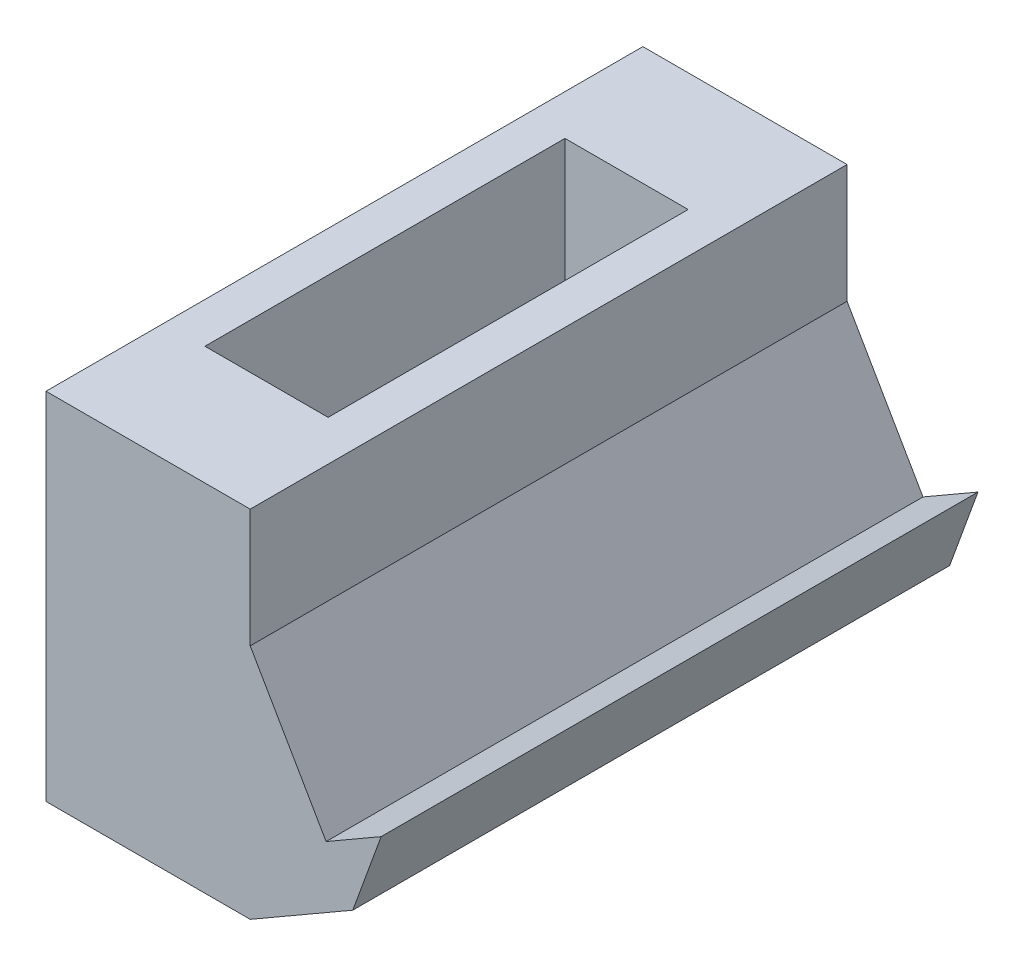
ISO-10303-21;
HEADER;
FILE_DESCRIPTION(('STEP AP214'),'2;1');
FILE_NAME('part.step','',(''),(''),'','','');
FILE_SCHEMA(('AUTOMOTIVE_DESIGN { 1 0 10303 214 1 1 1 1 }'));
ENDSEC;
DATA;
#1=APPLICATION_CONTEXT('core data for automotive mechanical design processes');
#2=APPLICATION_PROTOCOL_DEFINITION('international standard','automotive_design',2000,#1);
#3=PRODUCT_CONTEXT('',#1,'mechanical');
#4=PRODUCT('Part','Part','',(#3));
#5=PRODUCT_RELATED_PRODUCT_CATEGORY('part','',(#4));
#6=PRODUCT_DEFINITION_FORMATION('','',#4);
#7=PRODUCT_DEFINITION_CONTEXT('part definition',#1,'design');
#8=PRODUCT_DEFINITION('design','',#6,#7);
#9=PRODUCT_DEFINITION_SHAPE('','',#8);
#10=(LENGTH_UNIT() NAMED_UNIT(*) SI_UNIT(.MILLI.,.METRE.));
#11=(NAMED_UNIT(*) PLANE_ANGLE_UNIT() SI_UNIT($,.RADIAN.));
#12=(NAMED_UNIT(*) SI_UNIT($,.STERADIAN.) SOLID_ANGLE_UNIT());
#13=UNCERTAINTY_MEASURE_WITH_UNIT(LENGTH_MEASURE(1.E-05),#10,'distance_accuracy_value','');
#14=(GEOMETRIC_REPRESENTATION_CONTEXT(3) GLOBAL_UNCERTAINTY_ASSIGNED_CONTEXT((#13)) GLOBAL_UNIT_ASSIGNED_CONTEXT((#10,
#11,#12)) REPRESENTATION_CONTEXT('',''));
#15=CARTESIAN_POINT('',(0.,0.,0.));
#16=DIRECTION('',(0.,0.,1.));
#17=DIRECTION('',(1.,0.,0.));
#18=AXIS2_PLACEMENT_3D('',#15,#16,#17);
#19=CARTESIAN_POINT('',(4.31052631578947,-10.,-12.6));
#20=DIRECTION('',(1.,0.,0.));
#21=DIRECTION('',(0.,0.,-1.));
#22=AXIS2_PLACEMENT_3D('',#19,#20,#21);
#23=PLANE('',#22);
#24=DIRECTION('',(0.,0.,1.));
#25=VECTOR('',#24,1.);
#26=CARTESIAN_POINT('',(4.31052631578894,-3.12493109918928E-13,-24.0258440577185));
#27=LINE('',#26,#25);
#28=CARTESIAN_POINT('',(4.31052631578947,-3.12250225675825E-13,-12.6));
#29=VERTEX_POINT('',#28);
#30=CARTESIAN_POINT('',(4.31052631578894,-3.12493109918928E-13,12.6));
#31=VERTEX_POINT('',#30);
#32=EDGE_CURVE('E53',#29,#31,#27,.T.);
#33=ORIENTED_EDGE('',*,*,#32,.F.);
#34=DIRECTION('',(0.,1.,0.));
#35=VECTOR('',#34,1.);
#36=CARTESIAN_POINT('',(4.31052631578947,-10.,-12.6));
#37=LINE('',#36,#35);
#38=CARTESIAN_POINT('',(4.31052631578947,5.,-12.6));
#39=VERTEX_POINT('',#38);
#40=EDGE_CURVE('E40',#29,#39,#37,.T.);
#41=ORIENTED_EDGE('',*,*,#40,.T.);
#42=DIRECTION('',(0.,0.,-1.));
#43=VECTOR('',#42,1.);
#44=CARTESIAN_POINT('',(4.31052631578947,5.,-12.6));
#45=LINE('',#44,#43);
#46=CARTESIAN_POINT('',(4.31052631578947,5.,12.6));
#47=VERTEX_POINT('',#46);
#48=EDGE_CURVE('E181',#47,#39,#45,.T.);
#49=ORIENTED_EDGE('',*,*,#48,.F.);
#50=DIRECTION('',(0.,1.,0.));
#51=VECTOR('',#50,1.);
#52=CARTESIAN_POINT('',(4.31052631578947,-10.,12.6));
#53=LINE('',#52,#51);
#54=EDGE_CURVE('E11',#31,#47,#53,.T.);
#55=ORIENTED_EDGE('',*,*,#54,.F.);
#56=EDGE_LOOP('',(#33,#41,#49,#55));
#57=FACE_BOUND('',#56,.T.);
#58=ADVANCED_FACE('F37',(#57),#23,.T.);
#59=CARTESIAN_POINT('',(-4.31052631578947,-10.,12.6));
#60=DIRECTION('',(0.,0.,1.));
#61=DIRECTION('',(1.,0.,0.));
#62=AXIS2_PLACEMENT_3D('',#59,#60,#61);
#63=PLANE('',#62);
#64=DIRECTION('',(1.,0.,0.));
#65=VECTOR('',#64,1.);
#66=CARTESIAN_POINT('',(-4.31052631578947,-10.,12.6));
#67=LINE('',#66,#65);
#68=CARTESIAN_POINT('',(-4.31052631578947,-10.,12.6));
#69=VERTEX_POINT('',#68);
#70=CARTESIAN_POINT('',(4.31052631578947,-10.,12.6));
#71=VERTEX_POINT('',#70);
#72=EDGE_CURVE('E220',#69,#71,#67,.T.);
#73=ORIENTED_EDGE('',*,*,#72,.T.);
#74=DIRECTION('',(0.866025403784436,0.500000000000004,0.));
#75=VECTOR('',#74,1.);
#76=CARTESIAN_POINT('',(8.64065333471108,-7.50000000000013,12.6));
#77=LINE('',#76,#75);
#78=CARTESIAN_POINT('',(8.64065333471108,-7.50000000000013,12.6));
#79=VERTEX_POINT('',#78);
#80=EDGE_CURVE('E152',#71,#79,#77,.T.);
#81=ORIENTED_EDGE('',*,*,#80,.T.);
#82=DIRECTION('',(0.342020143325659,0.939692620785912,0.));
#83=VECTOR('',#82,1.);
#84=CARTESIAN_POINT('',(8.64065333471108,-7.50000000000013,12.6));
#85=LINE('',#84,#83);
#86=CARTESIAN_POINT('',(9.83772383635088,-4.21107582724944,12.6));
#87=VERTEX_POINT('',#86);
#88=EDGE_CURVE('E132',#79,#87,#85,.T.);
#89=ORIENTED_EDGE('',*,*,#88,.T.);
#90=DIRECTION('',(-0.86602540378443,-0.500000000000015,0.));
#91=VECTOR('',#90,1.);
#92=CARTESIAN_POINT('',(9.83772383635088,-4.21107582724944,12.6));
#93=LINE('',#92,#91);
#94=CARTESIAN_POINT('',(7.51577501775969,-5.55165360270765,12.6));
#95=VERTEX_POINT('',#94);
#96=EDGE_CURVE('E139',#87,#95,#93,.T.);
#97=ORIENTED_EDGE('',*,*,#96,.T.);
#98=DIRECTION('',(-0.500000000000014,0.866025403784431,0.));
#99=VECTOR('',#98,1.);
#100=CARTESIAN_POINT('',(4.31052631578894,-3.12493109918928E-13,12.6));
#101=LINE('',#100,#99);
#102=EDGE_CURVE('E146',#95,#31,#101,.T.);
#103=ORIENTED_EDGE('',*,*,#102,.T.);
#104=ORIENTED_EDGE('',*,*,#54,.T.);
#105=DIRECTION('',(1.,0.,0.));
#106=VECTOR('',#105,1.);
#107=CARTESIAN_POINT('',(-4.31052631578947,5.,12.6));
#108=LINE('',#107,#106);
#109=CARTESIAN_POINT('',(-4.31052631578947,5.,12.6));
#110=VERTEX_POINT('',#109);
#111=EDGE_CURVE('E190',#110,#47,#108,.T.);
#112=ORIENTED_EDGE('',*,*,#111,.F.);
#113=DIRECTION('',(0.,1.,0.));
#114=VECTOR('',#113,1.);
#115=CARTESIAN_POINT('',(-4.31052631578947,-10.,12.6));
#116=LINE('',#115,#114);
#117=EDGE_CURVE('E45',#69,#110,#116,.T.);
#118=ORIENTED_EDGE('',*,*,#117,.F.);
#119=EDGE_LOOP('',(#73,#81,#89,#97,#103,#104,#112,#118));
#120=FACE_BOUND('',#119,.T.);
#121=ADVANCED_FACE('F150',(#120),#63,.T.);
#122=CARTESIAN_POINT('',(-4.31052631578947,-10.,-12.6));
#123=DIRECTION('',(-1.,0.,0.));
#124=DIRECTION('',(0.,0.,1.));
#125=AXIS2_PLACEMENT_3D('',#122,#123,#124);
#126=PLANE('',#125);
#127=ORIENTED_EDGE('',*,*,#117,.T.);
#128=DIRECTION('',(0.,0.,1.));
#129=VECTOR('',#128,1.);
#130=CARTESIAN_POINT('',(-4.31052631578947,5.,-12.6));
#131=LINE('',#130,#129);
#132=CARTESIAN_POINT('',(-4.31052631578947,5.,-12.6));
#133=VERTEX_POINT('',#132);
#134=EDGE_CURVE('E187',#133,#110,#131,.T.);
#135=ORIENTED_EDGE('',*,*,#134,.F.);
#136=DIRECTION('',(0.,1.,0.));
#137=VECTOR('',#136,1.);
#138=CARTESIAN_POINT('',(-4.31052631578947,-10.,-12.6));
#139=LINE('',#138,#137);
#140=CARTESIAN_POINT('',(-4.31052631578947,-10.,-12.6));
#141=VERTEX_POINT('',#140);
#142=EDGE_CURVE('E222',#141,#133,#139,.T.);
#143=ORIENTED_EDGE('',*,*,#142,.F.);
#144=DIRECTION('',(0.,0.,1.));
#145=VECTOR('',#144,1.);
#146=CARTESIAN_POINT('',(-4.31052631578947,-10.,-12.6));
#147=LINE('',#146,#145);
#148=EDGE_CURVE('E217',#141,#69,#147,.T.);
#149=ORIENTED_EDGE('',*,*,#148,.T.);
#150=EDGE_LOOP('',(#127,#135,#143,#149));
#151=FACE_BOUND('',#150,.T.);
#152=ADVANCED_FACE('F242',(#151),#126,.T.);
#153=CARTESIAN_POINT('',(-4.31052631578947,-10.,-12.6));
#154=DIRECTION('',(0.,0.,-1.));
#155=DIRECTION('',(-1.,0.,0.));
#156=AXIS2_PLACEMENT_3D('',#153,#154,#155);
#157=PLANE('',#156);
#158=ORIENTED_EDGE('',*,*,#142,.T.);
#159=DIRECTION('',(-1.,0.,0.));
#160=VECTOR('',#159,1.);
#161=CARTESIAN_POINT('',(-4.31052631578947,5.,-12.6));
#162=LINE('',#161,#160);
#163=EDGE_CURVE('E184',#39,#133,#162,.T.);
#164=ORIENTED_EDGE('',*,*,#163,.F.);
#165=ORIENTED_EDGE('',*,*,#40,.F.);
#166=DIRECTION('',(-0.500000000000013,0.866025403784431,0.));
#167=VECTOR('',#166,1.);
#168=CARTESIAN_POINT('',(4.31052631578894,-3.12493109918928E-13,-12.6));
#169=LINE('',#168,#167);
#170=CARTESIAN_POINT('',(7.51577501775969,-5.55165360270765,-12.6));
#171=VERTEX_POINT('',#170);
#172=EDGE_CURVE('E153',#171,#29,#169,.T.);
#173=ORIENTED_EDGE('',*,*,#172,.F.);
#174=DIRECTION('',(-0.86602540378443,-0.500000000000015,0.));
#175=VECTOR('',#174,1.);
#176=CARTESIAN_POINT('',(9.83772383635088,-4.21107582724944,-12.6));
#177=LINE('',#176,#175);
#178=CARTESIAN_POINT('',(9.83772383635088,-4.21107582724944,-12.6));
#179=VERTEX_POINT('',#178);
#180=EDGE_CURVE('E136',#179,#171,#177,.T.);
#181=ORIENTED_EDGE('',*,*,#180,.F.);
#182=DIRECTION('',(0.342020143325659,0.939692620785912,0.));
#183=VECTOR('',#182,1.);
#184=CARTESIAN_POINT('',(8.64065333471108,-7.50000000000013,-12.6));
#185=LINE('',#184,#183);
#186=CARTESIAN_POINT('',(8.64065333471108,-7.50000000000013,-12.6));
#187=VERTEX_POINT('',#186);
#188=EDGE_CURVE('E133',#187,#179,#185,.T.);
#189=ORIENTED_EDGE('',*,*,#188,.F.);
#190=DIRECTION('',(0.866025403784436,0.500000000000004,0.));
#191=VECTOR('',#190,1.);
#192=CARTESIAN_POINT('',(8.64065333471108,-7.50000000000013,-12.6));
#193=LINE('',#192,#191);
#194=CARTESIAN_POINT('',(4.31052631578947,-10.,-12.6));
#195=VERTEX_POINT('',#194);
#196=EDGE_CURVE('E163',#195,#187,#193,.T.);
#197=ORIENTED_EDGE('',*,*,#196,.F.);
#198=DIRECTION('',(-1.,0.,0.));
#199=VECTOR('',#198,1.);
#200=CARTESIAN_POINT('',(-4.31052631578947,-10.,-12.6));
#201=LINE('',#200,#199);
#202=EDGE_CURVE('E214',#195,#141,#201,.T.);
#203=ORIENTED_EDGE('',*,*,#202,.T.);
#204=EDGE_LOOP('',(#158,#164,#165,#173,#181,#189,#197,#203));
#205=FACE_BOUND('',#204,.T.);
#206=ADVANCED_FACE('F226',(#205),#157,.T.);
#207=CARTESIAN_POINT('',(0.,-10.,0.));
#208=DIRECTION('',(0.,1.,0.));
#209=DIRECTION('',(0.,0.,1.));
#210=AXIS2_PLACEMENT_3D('',#207,#208,#209);
#211=PLANE('',#210);
#212=DIRECTION('',(1.,0.,0.));
#213=VECTOR('',#212,1.);
#214=CARTESIAN_POINT('',(-2.6,-10.,7.6));
#215=LINE('',#214,#213);
#216=CARTESIAN_POINT('',(-2.6,-10.,7.6));
#217=VERTEX_POINT('',#216);
#218=CARTESIAN_POINT('',(2.6,-10.,7.6));
#219=VERTEX_POINT('',#218);
#220=EDGE_CURVE('E200',#217,#219,#215,.T.);
#221=ORIENTED_EDGE('',*,*,#220,.T.);
#222=DIRECTION('',(0.,0.,-1.));
#223=VECTOR('',#222,1.);
#224=CARTESIAN_POINT('',(2.6,-10.,-7.6));
#225=LINE('',#224,#223);
#226=CARTESIAN_POINT('',(2.6,-10.,-7.6));
#227=VERTEX_POINT('',#226);
#228=EDGE_CURVE('E193',#219,#227,#225,.T.);
#229=ORIENTED_EDGE('',*,*,#228,.T.);
#230=DIRECTION('',(-1.,0.,0.));
#231=VECTOR('',#230,1.);
#232=CARTESIAN_POINT('',(-2.6,-10.,-7.6));
#233=LINE('',#232,#231);
#234=CARTESIAN_POINT('',(-2.6,-10.,-7.6));
#235=VERTEX_POINT('',#234);
#236=EDGE_CURVE('E196',#227,#235,#233,.T.);
#237=ORIENTED_EDGE('',*,*,#236,.T.);
#238=DIRECTION('',(0.,0.,1.));
#239=VECTOR('',#238,1.);
#240=CARTESIAN_POINT('',(-2.6,-10.,-7.6));
#241=LINE('',#240,#239);
#242=EDGE_CURVE('E61',#235,#217,#241,.T.);
#243=ORIENTED_EDGE('',*,*,#242,.T.);
#244=EDGE_LOOP('',(#221,#229,#237,#243));
#245=FACE_BOUND('',#244,.T.);
#246=DIRECTION('',(0.,0.,-1.));
#247=VECTOR('',#246,1.);
#248=CARTESIAN_POINT('',(4.31052631578947,-10.,-12.6));
#249=LINE('',#248,#247);
#250=EDGE_CURVE('E206',#71,#195,#249,.T.);
#251=ORIENTED_EDGE('',*,*,#250,.F.);
#252=ORIENTED_EDGE('',*,*,#72,.F.);
#253=ORIENTED_EDGE('',*,*,#148,.F.);
#254=ORIENTED_EDGE('',*,*,#202,.F.);
#255=EDGE_LOOP('',(#251,#252,#253,#254));
#256=FACE_BOUND('',#255,.T.);
#257=ADVANCED_FACE('F239',(#245,#256),#211,.F.);
#258=CARTESIAN_POINT('',(2.6,-10.,-7.6));
#259=DIRECTION('',(1.,0.,0.));
#260=DIRECTION('',(0.,0.,-1.));
#261=AXIS2_PLACEMENT_3D('',#258,#259,#260);
#262=PLANE('',#261);
#263=DIRECTION('',(0.,1.,0.));
#264=VECTOR('',#263,1.);
#265=CARTESIAN_POINT('',(2.6,-10.,7.6));
#266=LINE('',#265,#264);
#267=CARTESIAN_POINT('',(2.6,5.,7.6));
#268=VERTEX_POINT('',#267);
#269=EDGE_CURVE('E204',#219,#268,#266,.T.);
#270=ORIENTED_EDGE('',*,*,#269,.T.);
#271=DIRECTION('',(0.,0.,-1.));
#272=VECTOR('',#271,1.);
#273=CARTESIAN_POINT('',(2.6,5.,-7.6));
#274=LINE('',#273,#272);
#275=CARTESIAN_POINT('',(2.6,5.,-7.6));
#276=VERTEX_POINT('',#275);
#277=EDGE_CURVE('E169',#268,#276,#274,.T.);
#278=ORIENTED_EDGE('',*,*,#277,.T.);
#279=DIRECTION('',(0.,1.,0.));
#280=VECTOR('',#279,1.);
#281=CARTESIAN_POINT('',(2.6,-10.,-7.6));
#282=LINE('',#281,#280);
#283=EDGE_CURVE('E203',#227,#276,#282,.T.);
#284=ORIENTED_EDGE('',*,*,#283,.F.);
#285=ORIENTED_EDGE('',*,*,#228,.F.);
#286=EDGE_LOOP('',(#270,#278,#284,#285));
#287=FACE_BOUND('',#286,.T.);
#288=ADVANCED_FACE('F277',(#287),#262,.F.);
#289=CARTESIAN_POINT('',(-2.6,-10.,7.6));
#290=DIRECTION('',(0.,0.,1.));
#291=DIRECTION('',(1.,0.,0.));
#292=AXIS2_PLACEMENT_3D('',#289,#290,#291);
#293=PLANE('',#292);
#294=DIRECTION('',(0.,1.,0.));
#295=VECTOR('',#294,1.);
#296=CARTESIAN_POINT('',(-2.6,-10.,7.6));
#297=LINE('',#296,#295);
#298=CARTESIAN_POINT('',(-2.6,5.,7.6));
#299=VERTEX_POINT('',#298);
#300=EDGE_CURVE('E207',#217,#299,#297,.T.);
#301=ORIENTED_EDGE('',*,*,#300,.T.);
#302=DIRECTION('',(1.,0.,0.));
#303=VECTOR('',#302,1.);
#304=CARTESIAN_POINT('',(-2.6,5.,7.6));
#305=LINE('',#304,#303);
#306=EDGE_CURVE('E178',#299,#268,#305,.T.);
#307=ORIENTED_EDGE('',*,*,#306,.T.);
#308=ORIENTED_EDGE('',*,*,#269,.F.);
#309=ORIENTED_EDGE('',*,*,#220,.F.);
#310=EDGE_LOOP('',(#301,#307,#308,#309));
#311=FACE_BOUND('',#310,.T.);
#312=ADVANCED_FACE('F346',(#311),#293,.F.);
#313=CARTESIAN_POINT('',(-2.6,-10.,-7.6));
#314=DIRECTION('',(-1.,0.,0.));
#315=DIRECTION('',(0.,0.,1.));
#316=AXIS2_PLACEMENT_3D('',#313,#314,#315);
#317=PLANE('',#316);
#318=DIRECTION('',(0.,1.,0.));
#319=VECTOR('',#318,1.);
#320=CARTESIAN_POINT('',(-2.6,-10.,-7.6));
#321=LINE('',#320,#319);
#322=CARTESIAN_POINT('',(-2.6,5.,-7.6));
#323=VERTEX_POINT('',#322);
#324=EDGE_CURVE('E209',#235,#323,#321,.T.);
#325=ORIENTED_EDGE('',*,*,#324,.T.);
#326=DIRECTION('',(0.,0.,1.));
#327=VECTOR('',#326,1.);
#328=CARTESIAN_POINT('',(-2.6,5.,-7.6));
#329=LINE('',#328,#327);
#330=EDGE_CURVE('E175',#323,#299,#329,.T.);
#331=ORIENTED_EDGE('',*,*,#330,.T.);
#332=ORIENTED_EDGE('',*,*,#300,.F.);
#333=ORIENTED_EDGE('',*,*,#242,.F.);
#334=EDGE_LOOP('',(#325,#331,#332,#333));
#335=FACE_BOUND('',#334,.T.);
#336=ADVANCED_FACE('F336',(#335),#317,.F.);
#337=CARTESIAN_POINT('',(-2.6,-10.,-7.6));
#338=DIRECTION('',(0.,0.,-1.));
#339=DIRECTION('',(-1.,0.,0.));
#340=AXIS2_PLACEMENT_3D('',#337,#338,#339);
#341=PLANE('',#340);
#342=ORIENTED_EDGE('',*,*,#283,.T.);
#343=DIRECTION('',(-1.,0.,0.));
#344=VECTOR('',#343,1.);
#345=CARTESIAN_POINT('',(-2.6,5.,-7.6));
#346=LINE('',#345,#344);
#347=EDGE_CURVE('E172',#276,#323,#346,.T.);
#348=ORIENTED_EDGE('',*,*,#347,.T.);
#349=ORIENTED_EDGE('',*,*,#324,.F.);
#350=ORIENTED_EDGE('',*,*,#236,.F.);
#351=EDGE_LOOP('',(#342,#348,#349,#350));
#352=FACE_BOUND('',#351,.T.);
#353=ADVANCED_FACE('F328',(#352),#341,.F.);
#354=CARTESIAN_POINT('',(0.,5.,0.));
#355=DIRECTION('',(0.,1.,0.));
#356=DIRECTION('',(0.,0.,1.));
#357=AXIS2_PLACEMENT_3D('',#354,#355,#356);
#358=PLANE('',#357);
#359=ORIENTED_EDGE('',*,*,#48,.T.);
#360=ORIENTED_EDGE('',*,*,#163,.T.);
#361=ORIENTED_EDGE('',*,*,#134,.T.);
#362=ORIENTED_EDGE('',*,*,#111,.T.);
#363=EDGE_LOOP('',(#359,#360,#361,#362));
#364=FACE_BOUND('',#363,.T.);
#365=ORIENTED_EDGE('',*,*,#347,.F.);
#366=ORIENTED_EDGE('',*,*,#277,.F.);
#367=ORIENTED_EDGE('',*,*,#306,.F.);
#368=ORIENTED_EDGE('',*,*,#330,.F.);
#369=EDGE_LOOP('',(#365,#366,#367,#368));
#370=FACE_BOUND('',#369,.T.);
#371=ADVANCED_FACE('F229',(#364,#370),#358,.T.);
#372=CARTESIAN_POINT('',(4.31052631578894,-3.12493109918928E-13,-24.0258440577185));
#373=DIRECTION('',(0.866025403784431,0.500000000000013,0.));
#374=DIRECTION('',(-0.500000000000013,0.866025403784431,0.));
#375=AXIS2_PLACEMENT_3D('',#372,#373,#374);
#376=PLANE('',#375);
#377=DIRECTION('',(0.,0.,1.));
#378=VECTOR('',#377,1.);
#379=CARTESIAN_POINT('',(7.51577501775969,-5.55165360270765,-24.0258440577185));
#380=LINE('',#379,#378);
#381=EDGE_CURVE('E142',#171,#95,#380,.T.);
#382=ORIENTED_EDGE('',*,*,#381,.F.);
#383=ORIENTED_EDGE('',*,*,#172,.T.);
#384=ORIENTED_EDGE('',*,*,#32,.T.);
#385=ORIENTED_EDGE('',*,*,#102,.F.);
#386=EDGE_LOOP('',(#382,#383,#384,#385));
#387=FACE_BOUND('',#386,.T.);
#388=ADVANCED_FACE('F233',(#387),#376,.T.);
#389=CARTESIAN_POINT('',(8.64065333471108,-7.50000000000013,-24.0258440577185));
#390=DIRECTION('',(0.500000000000004,-0.866025403784436,0.));
#391=DIRECTION('',(0.866025403784436,0.500000000000004,0.));
#392=AXIS2_PLACEMENT_3D('',#389,#390,#391);
#393=PLANE('',#392);
#394=ORIENTED_EDGE('',*,*,#250,.T.);
#395=ORIENTED_EDGE('',*,*,#196,.T.);
#396=DIRECTION('',(0.,0.,1.));
#397=VECTOR('',#396,1.);
#398=CARTESIAN_POINT('',(8.64065333471108,-7.50000000000013,-24.0258440577185));
#399=LINE('',#398,#397);
#400=EDGE_CURVE('E162',#187,#79,#399,.T.);
#401=ORIENTED_EDGE('',*,*,#400,.T.);
#402=ORIENTED_EDGE('',*,*,#80,.F.);
#403=EDGE_LOOP('',(#394,#395,#401,#402));
#404=FACE_BOUND('',#403,.T.);
#405=ADVANCED_FACE('F236',(#404),#393,.T.);
#406=CARTESIAN_POINT('',(8.64065333471108,-7.50000000000013,-24.0258440577185));
#407=DIRECTION('',(0.939692620785912,-0.342020143325659,0.));
#408=DIRECTION('',(0.342020143325659,0.939692620785912,0.));
#409=AXIS2_PLACEMENT_3D('',#406,#407,#408);
#410=PLANE('',#409);
#411=ORIENTED_EDGE('',*,*,#400,.F.);
#412=ORIENTED_EDGE('',*,*,#188,.T.);
#413=DIRECTION('',(0.,0.,1.));
#414=VECTOR('',#413,1.);
#415=CARTESIAN_POINT('',(9.83772383635088,-4.21107582724944,-24.0258440577185));
#416=LINE('',#415,#414);
#417=EDGE_CURVE('E127',#179,#87,#416,.T.);
#418=ORIENTED_EDGE('',*,*,#417,.T.);
#419=ORIENTED_EDGE('',*,*,#88,.F.);
#420=EDGE_LOOP('',(#411,#412,#418,#419));
#421=FACE_BOUND('',#420,.T.);
#422=ADVANCED_FACE('F130',(#421),#410,.T.);
#423=CARTESIAN_POINT('',(9.83772383635088,-4.21107582724944,-24.0258440577185));
#424=DIRECTION('',(-0.500000000000015,0.86602540378443,0.));
#425=DIRECTION('',(-0.86602540378443,-0.500000000000015,0.));
#426=AXIS2_PLACEMENT_3D('',#423,#424,#425);
#427=PLANE('',#426);
#428=ORIENTED_EDGE('',*,*,#417,.F.);
#429=ORIENTED_EDGE('',*,*,#180,.T.);
#430=ORIENTED_EDGE('',*,*,#381,.T.);
#431=ORIENTED_EDGE('',*,*,#96,.F.);
#432=EDGE_LOOP('',(#428,#429,#430,#431));
#433=FACE_BOUND('',#432,.T.);
#434=ADVANCED_FACE('F140',(#433),#427,.T.);
#435=CLOSED_SHELL('',(#58,#121,#152,#206,#257,#288,#312,#336,#353,#371,#388,#405,#422,#434));
#436=MANIFOLD_SOLID_BREP('B2',#435);
#437=ADVANCED_BREP_SHAPE_REPRESENTATION('',(#18,#436),#14);
#438=SHAPE_DEFINITION_REPRESENTATION(#9,#437);
ENDSEC;
END-ISO-10303-21;
